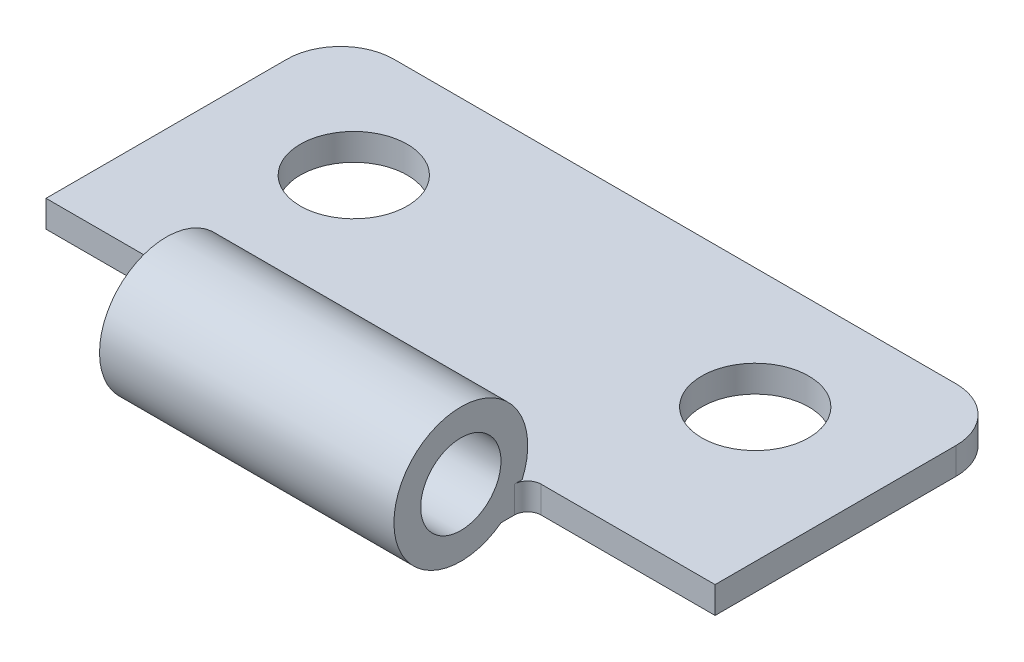
ISO-10303-21;
HEADER;
FILE_DESCRIPTION(('STEP AP214'),'2;1');
FILE_NAME('part.step','',(''),(''),'','','');
FILE_SCHEMA(('AUTOMOTIVE_DESIGN { 1 0 10303 214 1 1 1 1 }'));
ENDSEC;
DATA;
#1=APPLICATION_CONTEXT('core data for automotive mechanical design processes');
#2=APPLICATION_PROTOCOL_DEFINITION('international standard','automotive_design',2000,#1);
#3=PRODUCT_CONTEXT('',#1,'mechanical');
#4=PRODUCT('Part','Part','',(#3));
#5=PRODUCT_RELATED_PRODUCT_CATEGORY('part','',(#4));
#6=PRODUCT_DEFINITION_FORMATION('','',#4);
#7=PRODUCT_DEFINITION_CONTEXT('part definition',#1,'design');
#8=PRODUCT_DEFINITION('design','',#6,#7);
#9=PRODUCT_DEFINITION_SHAPE('','',#8);
#10=(LENGTH_UNIT() NAMED_UNIT(*) SI_UNIT(.MILLI.,.METRE.));
#11=(NAMED_UNIT(*) PLANE_ANGLE_UNIT() SI_UNIT($,.RADIAN.));
#12=(NAMED_UNIT(*) SI_UNIT($,.STERADIAN.) SOLID_ANGLE_UNIT());
#13=UNCERTAINTY_MEASURE_WITH_UNIT(LENGTH_MEASURE(1.E-05),#10,'distance_accuracy_value','');
#14=(GEOMETRIC_REPRESENTATION_CONTEXT(3) GLOBAL_UNCERTAINTY_ASSIGNED_CONTEXT((#13)) GLOBAL_UNIT_ASSIGNED_CONTEXT((#10,
#11,#12)) REPRESENTATION_CONTEXT('',''));
#15=CARTESIAN_POINT('',(0.,0.,0.));
#16=DIRECTION('',(0.,0.,1.));
#17=DIRECTION('',(1.,0.,0.));
#18=AXIS2_PLACEMENT_3D('',#15,#16,#17);
#19=CARTESIAN_POINT('',(0.,1.,0.));
#20=DIRECTION('',(0.,-1.,0.));
#21=DIRECTION('',(0.,0.,-1.));
#22=AXIS2_PLACEMENT_3D('',#19,#20,#21);
#23=PLANE('',#22);
#24=DIRECTION('',(-1.,0.,0.));
#25=VECTOR('',#24,1.);
#26=CARTESIAN_POINT('',(5.5,1.,-0.791287847477918));
#27=LINE('',#26,#25);
#28=CARTESIAN_POINT('',(5.5,1.,-0.791287847477918));
#29=VERTEX_POINT('',#28);
#30=CARTESIAN_POINT('',(-5.5,1.,-0.791287847477918));
#31=VERTEX_POINT('',#30);
#32=EDGE_CURVE('E56',#29,#31,#27,.T.);
#33=ORIENTED_EDGE('',*,*,#32,.F.);
#34=DIRECTION('',(0.,0.,1.));
#35=VECTOR('',#34,1.);
#36=CARTESIAN_POINT('',(5.5,1.,0.));
#37=LINE('',#36,#35);
#38=CARTESIAN_POINT('',(5.5,1.,-0.499999999999997));
#39=VERTEX_POINT('',#38);
#40=EDGE_CURVE('E153',#29,#39,#37,.T.);
#41=ORIENTED_EDGE('',*,*,#40,.T.);
#42=CARTESIAN_POINT('',(6.,1.,-0.499999999999997));
#43=DIRECTION('',(0.,-1.,0.));
#44=DIRECTION('',(0.,0.,-1.));
#45=AXIS2_PLACEMENT_3D('',#42,#43,#44);
#46=CIRCLE('',#45,0.5);
#47=CARTESIAN_POINT('',(6.,1.,-0.999999999999997));
#48=VERTEX_POINT('',#47);
#49=EDGE_CURVE('E236',#39,#48,#46,.T.);
#50=ORIENTED_EDGE('',*,*,#49,.T.);
#51=DIRECTION('',(1.,0.,0.));
#52=VECTOR('',#51,1.);
#53=CARTESIAN_POINT('',(5.5,1.,-0.999999999999997));
#54=LINE('',#53,#52);
#55=CARTESIAN_POINT('',(12.5,1.,-0.999999999999996));
#56=VERTEX_POINT('',#55);
#57=EDGE_CURVE('E182',#48,#56,#54,.T.);
#58=ORIENTED_EDGE('',*,*,#57,.T.);
#59=DIRECTION('',(0.,0.,-1.));
#60=VECTOR('',#59,1.);
#61=CARTESIAN_POINT('',(12.5,1.,-12.));
#62=LINE('',#61,#60);
#63=CARTESIAN_POINT('',(12.5,1.,-10.));
#64=VERTEX_POINT('',#63);
#65=EDGE_CURVE('E184',#56,#64,#62,.T.);
#66=ORIENTED_EDGE('',*,*,#65,.T.);
#67=CARTESIAN_POINT('',(10.5,1.,-10.));
#68=DIRECTION('',(0.,-1.,0.));
#69=DIRECTION('',(0.,0.,-1.));
#70=AXIS2_PLACEMENT_3D('',#67,#68,#69);
#71=CIRCLE('',#70,2.);
#72=CARTESIAN_POINT('',(10.5,1.,-12.));
#73=VERTEX_POINT('',#72);
#74=EDGE_CURVE('E219',#64,#73,#71,.F.);
#75=ORIENTED_EDGE('',*,*,#74,.T.);
#76=DIRECTION('',(-1.,0.,0.));
#77=VECTOR('',#76,1.);
#78=CARTESIAN_POINT('',(-12.5,1.,-12.));
#79=LINE('',#78,#77);
#80=CARTESIAN_POINT('',(-10.5,1.,-12.));
#81=VERTEX_POINT('',#80);
#82=EDGE_CURVE('E189',#73,#81,#79,.T.);
#83=ORIENTED_EDGE('',*,*,#82,.T.);
#84=CARTESIAN_POINT('',(-10.5,1.,-10.));
#85=DIRECTION('',(0.,-1.,0.));
#86=DIRECTION('',(0.,0.,-1.));
#87=AXIS2_PLACEMENT_3D('',#84,#85,#86);
#88=CIRCLE('',#87,2.);
#89=CARTESIAN_POINT('',(-12.5,1.,-10.));
#90=VERTEX_POINT('',#89);
#91=EDGE_CURVE('E225',#81,#90,#88,.F.);
#92=ORIENTED_EDGE('',*,*,#91,.T.);
#93=DIRECTION('',(0.,0.,1.));
#94=VECTOR('',#93,1.);
#95=CARTESIAN_POINT('',(-12.5,1.,-0.999999999999996));
#96=LINE('',#95,#94);
#97=CARTESIAN_POINT('',(-12.5,1.,-0.999999999999996));
#98=VERTEX_POINT('',#97);
#99=EDGE_CURVE('E180',#90,#98,#96,.T.);
#100=ORIENTED_EDGE('',*,*,#99,.T.);
#101=DIRECTION('',(1.,0.,0.));
#102=VECTOR('',#101,1.);
#103=CARTESIAN_POINT('',(-12.5,1.,-0.999999999999996));
#104=LINE('',#103,#102);
#105=CARTESIAN_POINT('',(-6.,1.,-0.999999999999997));
#106=VERTEX_POINT('',#105);
#107=EDGE_CURVE('E177',#98,#106,#104,.T.);
#108=ORIENTED_EDGE('',*,*,#107,.T.);
#109=CARTESIAN_POINT('',(-6.,1.,-0.499999999999997));
#110=DIRECTION('',(0.,-1.,0.));
#111=DIRECTION('',(0.,0.,-1.));
#112=AXIS2_PLACEMENT_3D('',#109,#110,#111);
#113=CIRCLE('',#112,0.5);
#114=CARTESIAN_POINT('',(-5.5,1.,-0.499999999999997));
#115=VERTEX_POINT('',#114);
#116=EDGE_CURVE('E11',#106,#115,#113,.T.);
#117=ORIENTED_EDGE('',*,*,#116,.T.);
#118=DIRECTION('',(0.,0.,1.));
#119=VECTOR('',#118,1.);
#120=CARTESIAN_POINT('',(-5.5,1.,0.));
#121=LINE('',#120,#119);
#122=EDGE_CURVE('E54',#31,#115,#121,.T.);
#123=ORIENTED_EDGE('',*,*,#122,.F.);
#124=EDGE_LOOP('',(#33,#41,#50,#58,#66,#75,#83,#92,#100,#108,#117,#123));
#125=FACE_BOUND('',#124,.T.);
#126=CARTESIAN_POINT('',(7.5,1.,-7.5));
#127=DIRECTION('',(0.,1.,0.));
#128=DIRECTION('',(0.,0.,1.));
#129=AXIS2_PLACEMENT_3D('',#126,#127,#128);
#130=CIRCLE('',#129,2.);
#131=CARTESIAN_POINT('',(7.5,1.,-5.5));
#132=VERTEX_POINT('',#131);
#133=EDGE_CURVE('E171',#132,#132,#130,.T.);
#134=ORIENTED_EDGE('',*,*,#133,.F.);
#135=EDGE_LOOP('',(#134));
#136=FACE_BOUND('',#135,.T.);
#137=CARTESIAN_POINT('',(-7.5,1.,-7.5));
#138=DIRECTION('',(0.,1.,0.));
#139=DIRECTION('',(0.,0.,1.));
#140=AXIS2_PLACEMENT_3D('',#137,#138,#139);
#141=CIRCLE('',#140,2.);
#142=CARTESIAN_POINT('',(-7.5,1.,-5.5));
#143=VERTEX_POINT('',#142);
#144=EDGE_CURVE('E164',#143,#143,#141,.T.);
#145=ORIENTED_EDGE('',*,*,#144,.F.);
#146=EDGE_LOOP('',(#145));
#147=FACE_BOUND('',#146,.T.);
#148=ADVANCED_FACE('F41',(#125,#136,#147),#23,.F.);
#149=CARTESIAN_POINT('',(0.,0.,0.));
#150=DIRECTION('',(0.,-1.,0.));
#151=DIRECTION('',(0.,0.,-1.));
#152=AXIS2_PLACEMENT_3D('',#149,#150,#151);
#153=PLANE('',#152);
#154=CARTESIAN_POINT('',(7.5,0.,-7.5));
#155=DIRECTION('',(0.,1.,0.));
#156=DIRECTION('',(0.,0.,1.));
#157=AXIS2_PLACEMENT_3D('',#154,#155,#156);
#158=CIRCLE('',#157,2.);
#159=CARTESIAN_POINT('',(7.5,0.,-5.5));
#160=VERTEX_POINT('',#159);
#161=EDGE_CURVE('E166',#160,#160,#158,.T.);
#162=ORIENTED_EDGE('',*,*,#161,.T.);
#163=EDGE_LOOP('',(#162));
#164=FACE_BOUND('',#163,.T.);
#165=DIRECTION('',(0.,0.,1.));
#166=VECTOR('',#165,1.);
#167=CARTESIAN_POINT('',(-12.5,0.,-0.999999999999996));
#168=LINE('',#167,#166);
#169=CARTESIAN_POINT('',(-12.5,0.,-10.));
#170=VERTEX_POINT('',#169);
#171=CARTESIAN_POINT('',(-12.5,0.,-0.999999999999996));
#172=VERTEX_POINT('',#171);
#173=EDGE_CURVE('E172',#170,#172,#168,.T.);
#174=ORIENTED_EDGE('',*,*,#173,.F.);
#175=CARTESIAN_POINT('',(-10.5,0.,-10.));
#176=DIRECTION('',(0.,-1.,0.));
#177=DIRECTION('',(0.,0.,-1.));
#178=AXIS2_PLACEMENT_3D('',#175,#176,#177);
#179=CIRCLE('',#178,2.);
#180=CARTESIAN_POINT('',(-10.5,0.,-12.));
#181=VERTEX_POINT('',#180);
#182=EDGE_CURVE('E214',#170,#181,#179,.T.);
#183=ORIENTED_EDGE('',*,*,#182,.T.);
#184=DIRECTION('',(-1.,0.,0.));
#185=VECTOR('',#184,1.);
#186=CARTESIAN_POINT('',(-12.5,0.,-12.));
#187=LINE('',#186,#185);
#188=CARTESIAN_POINT('',(10.5,0.,-12.));
#189=VERTEX_POINT('',#188);
#190=EDGE_CURVE('E179',#189,#181,#187,.T.);
#191=ORIENTED_EDGE('',*,*,#190,.F.);
#192=CARTESIAN_POINT('',(10.5,0.,-10.));
#193=DIRECTION('',(0.,-1.,0.));
#194=DIRECTION('',(0.,0.,-1.));
#195=AXIS2_PLACEMENT_3D('',#192,#193,#194);
#196=CIRCLE('',#195,2.);
#197=CARTESIAN_POINT('',(12.5,0.,-10.));
#198=VERTEX_POINT('',#197);
#199=EDGE_CURVE('E212',#189,#198,#196,.T.);
#200=ORIENTED_EDGE('',*,*,#199,.T.);
#201=DIRECTION('',(0.,0.,-1.));
#202=VECTOR('',#201,1.);
#203=CARTESIAN_POINT('',(12.5,0.,-12.));
#204=LINE('',#203,#202);
#205=CARTESIAN_POINT('',(12.5,0.,-0.999999999999996));
#206=VERTEX_POINT('',#205);
#207=EDGE_CURVE('E198',#206,#198,#204,.T.);
#208=ORIENTED_EDGE('',*,*,#207,.F.);
#209=DIRECTION('',(1.,0.,0.));
#210=VECTOR('',#209,1.);
#211=CARTESIAN_POINT('',(5.5,0.,-0.999999999999997));
#212=LINE('',#211,#210);
#213=CARTESIAN_POINT('',(6.,0.,-0.999999999999997));
#214=VERTEX_POINT('',#213);
#215=EDGE_CURVE('E142',#214,#206,#212,.T.);
#216=ORIENTED_EDGE('',*,*,#215,.F.);
#217=CARTESIAN_POINT('',(6.,0.,-0.499999999999997));
#218=DIRECTION('',(0.,-1.,0.));
#219=DIRECTION('',(0.,0.,-1.));
#220=AXIS2_PLACEMENT_3D('',#217,#218,#219);
#221=CIRCLE('',#220,0.5);
#222=CARTESIAN_POINT('',(5.5,0.,-0.499999999999997));
#223=VERTEX_POINT('',#222);
#224=EDGE_CURVE('E140',#214,#223,#221,.F.);
#225=ORIENTED_EDGE('',*,*,#224,.T.);
#226=DIRECTION('',(0.,0.,-1.));
#227=VECTOR('',#226,1.);
#228=CARTESIAN_POINT('',(5.5,0.,0.));
#229=LINE('',#228,#227);
#230=CARTESIAN_POINT('',(5.5,0.,0.));
#231=VERTEX_POINT('',#230);
#232=EDGE_CURVE('E129',#231,#223,#229,.T.);
#233=ORIENTED_EDGE('',*,*,#232,.F.);
#234=DIRECTION('',(1.,0.,0.));
#235=VECTOR('',#234,1.);
#236=CARTESIAN_POINT('',(-5.5,0.,0.));
#237=LINE('',#236,#235);
#238=CARTESIAN_POINT('',(-5.5,0.,0.));
#239=VERTEX_POINT('',#238);
#240=EDGE_CURVE('E132',#239,#231,#237,.T.);
#241=ORIENTED_EDGE('',*,*,#240,.F.);
#242=DIRECTION('',(0.,0.,1.));
#243=VECTOR('',#242,1.);
#244=CARTESIAN_POINT('',(-5.5,0.,0.));
#245=LINE('',#244,#243);
#246=CARTESIAN_POINT('',(-5.5,0.,-0.499999999999997));
#247=VERTEX_POINT('',#246);
#248=EDGE_CURVE('E146',#247,#239,#245,.T.);
#249=ORIENTED_EDGE('',*,*,#248,.F.);
#250=CARTESIAN_POINT('',(-6.,0.,-0.499999999999997));
#251=DIRECTION('',(0.,-1.,0.));
#252=DIRECTION('',(0.,0.,-1.));
#253=AXIS2_PLACEMENT_3D('',#250,#251,#252);
#254=CIRCLE('',#253,0.5);
#255=CARTESIAN_POINT('',(-6.,0.,-0.999999999999997));
#256=VERTEX_POINT('',#255);
#257=EDGE_CURVE('E47',#247,#256,#254,.F.);
#258=ORIENTED_EDGE('',*,*,#257,.T.);
#259=DIRECTION('',(1.,0.,0.));
#260=VECTOR('',#259,1.);
#261=CARTESIAN_POINT('',(-12.5,0.,-0.999999999999996));
#262=LINE('',#261,#260);
#263=EDGE_CURVE('E194',#172,#256,#262,.T.);
#264=ORIENTED_EDGE('',*,*,#263,.F.);
#265=EDGE_LOOP('',(#174,#183,#191,#200,#208,#216,#225,#233,#241,#249,#258,#264));
#266=FACE_BOUND('',#265,.T.);
#267=CARTESIAN_POINT('',(-7.5,0.,-7.5));
#268=DIRECTION('',(0.,1.,0.));
#269=DIRECTION('',(0.,0.,1.));
#270=AXIS2_PLACEMENT_3D('',#267,#268,#269);
#271=CIRCLE('',#270,2.);
#272=CARTESIAN_POINT('',(-7.5,0.,-5.5));
#273=VERTEX_POINT('',#272);
#274=EDGE_CURVE('E165',#273,#273,#271,.T.);
#275=ORIENTED_EDGE('',*,*,#274,.T.);
#276=EDGE_LOOP('',(#275));
#277=FACE_BOUND('',#276,.T.);
#278=ADVANCED_FACE('F131',(#164,#266,#277),#153,.T.);
#279=CARTESIAN_POINT('',(-12.5,1.,-0.999999999999996));
#280=DIRECTION('',(1.,0.,0.));
#281=DIRECTION('',(0.,0.,-1.));
#282=AXIS2_PLACEMENT_3D('',#279,#280,#281);
#283=PLANE('',#282);
#284=ORIENTED_EDGE('',*,*,#99,.F.);
#285=DIRECTION('',(0.,-1.,0.));
#286=VECTOR('',#285,1.);
#287=CARTESIAN_POINT('',(-12.5,1.,-10.));
#288=LINE('',#287,#286);
#289=EDGE_CURVE('E206',#90,#170,#288,.T.);
#290=ORIENTED_EDGE('',*,*,#289,.T.);
#291=ORIENTED_EDGE('',*,*,#173,.T.);
#292=DIRECTION('',(0.,-1.,0.));
#293=VECTOR('',#292,1.);
#294=CARTESIAN_POINT('',(-12.5,1.,-0.999999999999996));
#295=LINE('',#294,#293);
#296=EDGE_CURVE('E204',#98,#172,#295,.T.);
#297=ORIENTED_EDGE('',*,*,#296,.F.);
#298=EDGE_LOOP('',(#284,#290,#291,#297));
#299=FACE_BOUND('',#298,.T.);
#300=ADVANCED_FACE('F249',(#299),#283,.F.);
#301=CARTESIAN_POINT('',(-12.5,1.,-0.999999999999996));
#302=DIRECTION('',(0.,0.,-1.));
#303=DIRECTION('',(-1.,0.,0.));
#304=AXIS2_PLACEMENT_3D('',#301,#302,#303);
#305=PLANE('',#304);
#306=ORIENTED_EDGE('',*,*,#263,.T.);
#307=DIRECTION('',(0.,-1.,0.));
#308=VECTOR('',#307,1.);
#309=CARTESIAN_POINT('',(-6.,1.,-0.999999999999997));
#310=LINE('',#309,#308);
#311=EDGE_CURVE('E231',#256,#106,#310,.F.);
#312=ORIENTED_EDGE('',*,*,#311,.T.);
#313=ORIENTED_EDGE('',*,*,#107,.F.);
#314=ORIENTED_EDGE('',*,*,#296,.T.);
#315=EDGE_LOOP('',(#306,#312,#313,#314));
#316=FACE_BOUND('',#315,.T.);
#317=ADVANCED_FACE('F243',(#316),#305,.F.);
#318=CARTESIAN_POINT('',(-5.5,1.,0.));
#319=DIRECTION('',(1.,0.,0.));
#320=DIRECTION('',(0.,0.,-1.));
#321=AXIS2_PLACEMENT_3D('',#318,#319,#320);
#322=PLANE('',#321);
#323=ORIENTED_EDGE('',*,*,#248,.T.);
#324=CARTESIAN_POINT('',(-5.5,2.,1.5));
#325=DIRECTION('',(1.,0.,0.));
#326=DIRECTION('',(0.,0.,-1.));
#327=AXIS2_PLACEMENT_3D('',#324,#325,#326);
#328=CIRCLE('',#327,2.5);
#329=EDGE_CURVE('E149',#31,#239,#328,.T.);
#330=ORIENTED_EDGE('',*,*,#329,.F.);
#331=ORIENTED_EDGE('',*,*,#122,.T.);
#332=DIRECTION('',(0.,-1.,0.));
#333=VECTOR('',#332,1.);
#334=CARTESIAN_POINT('',(-5.5,0.,-0.499999999999997));
#335=LINE('',#334,#333);
#336=EDGE_CURVE('E233',#115,#247,#335,.T.);
#337=ORIENTED_EDGE('',*,*,#336,.T.);
#338=EDGE_LOOP('',(#323,#330,#331,#337));
#339=FACE_BOUND('',#338,.T.);
#340=CARTESIAN_POINT('',(-5.5,2.,1.5));
#341=DIRECTION('',(1.,0.,0.));
#342=DIRECTION('',(0.,0.,-1.));
#343=AXIS2_PLACEMENT_3D('',#340,#341,#342);
#344=CIRCLE('',#343,1.5);
#345=CARTESIAN_POINT('',(-5.5,2.,0.));
#346=VERTEX_POINT('',#345);
#347=EDGE_CURVE('E158',#346,#346,#344,.T.);
#348=ORIENTED_EDGE('',*,*,#347,.T.);
#349=EDGE_LOOP('',(#348));
#350=FACE_BOUND('',#349,.T.);
#351=ADVANCED_FACE('F305',(#339,#350),#322,.F.);
#352=CARTESIAN_POINT('',(5.5,1.,0.));
#353=DIRECTION('',(-1.,0.,0.));
#354=DIRECTION('',(0.,0.,1.));
#355=AXIS2_PLACEMENT_3D('',#352,#353,#354);
#356=PLANE('',#355);
#357=DIRECTION('',(0.,-1.,0.));
#358=VECTOR('',#357,1.);
#359=CARTESIAN_POINT('',(5.5,1.,-0.499999999999997));
#360=LINE('',#359,#358);
#361=EDGE_CURVE('E230',#223,#39,#360,.F.);
#362=ORIENTED_EDGE('',*,*,#361,.T.);
#363=ORIENTED_EDGE('',*,*,#40,.F.);
#364=CARTESIAN_POINT('',(5.5,2.,1.5));
#365=DIRECTION('',(1.,0.,0.));
#366=DIRECTION('',(0.,0.,-1.));
#367=AXIS2_PLACEMENT_3D('',#364,#365,#366);
#368=CIRCLE('',#367,2.5);
#369=EDGE_CURVE('E147',#29,#231,#368,.T.);
#370=ORIENTED_EDGE('',*,*,#369,.T.);
#371=ORIENTED_EDGE('',*,*,#232,.T.);
#372=EDGE_LOOP('',(#362,#363,#370,#371));
#373=FACE_BOUND('',#372,.T.);
#374=CARTESIAN_POINT('',(5.5,2.,1.5));
#375=DIRECTION('',(1.,0.,0.));
#376=DIRECTION('',(0.,0.,-1.));
#377=AXIS2_PLACEMENT_3D('',#374,#375,#376);
#378=CIRCLE('',#377,1.5);
#379=CARTESIAN_POINT('',(5.5,2.,0.));
#380=VERTEX_POINT('',#379);
#381=EDGE_CURVE('E156',#380,#380,#378,.T.);
#382=ORIENTED_EDGE('',*,*,#381,.F.);
#383=EDGE_LOOP('',(#382));
#384=FACE_BOUND('',#383,.T.);
#385=ADVANCED_FACE('F151',(#373,#384),#356,.F.);
#386=CARTESIAN_POINT('',(5.5,1.,-0.999999999999997));
#387=DIRECTION('',(0.,0.,-1.));
#388=DIRECTION('',(-1.,0.,0.));
#389=AXIS2_PLACEMENT_3D('',#386,#387,#388);
#390=PLANE('',#389);
#391=ORIENTED_EDGE('',*,*,#57,.F.);
#392=DIRECTION('',(0.,-1.,0.));
#393=VECTOR('',#392,1.);
#394=CARTESIAN_POINT('',(6.,0.,-0.999999999999997));
#395=LINE('',#394,#393);
#396=EDGE_CURVE('E228',#48,#214,#395,.T.);
#397=ORIENTED_EDGE('',*,*,#396,.T.);
#398=ORIENTED_EDGE('',*,*,#215,.T.);
#399=DIRECTION('',(0.,-1.,0.));
#400=VECTOR('',#399,1.);
#401=CARTESIAN_POINT('',(12.5,1.,-0.999999999999996));
#402=LINE('',#401,#400);
#403=EDGE_CURVE('E192',#56,#206,#402,.T.);
#404=ORIENTED_EDGE('',*,*,#403,.F.);
#405=EDGE_LOOP('',(#391,#397,#398,#404));
#406=FACE_BOUND('',#405,.T.);
#407=ADVANCED_FACE('F275',(#406),#390,.F.);
#408=CARTESIAN_POINT('',(12.5,1.,-12.));
#409=DIRECTION('',(-1.,0.,0.));
#410=DIRECTION('',(0.,0.,1.));
#411=AXIS2_PLACEMENT_3D('',#408,#409,#410);
#412=PLANE('',#411);
#413=ORIENTED_EDGE('',*,*,#207,.T.);
#414=DIRECTION('',(0.,-1.,0.));
#415=VECTOR('',#414,1.);
#416=CARTESIAN_POINT('',(12.5,1.,-10.));
#417=LINE('',#416,#415);
#418=EDGE_CURVE('E223',#198,#64,#417,.F.);
#419=ORIENTED_EDGE('',*,*,#418,.T.);
#420=ORIENTED_EDGE('',*,*,#65,.F.);
#421=ORIENTED_EDGE('',*,*,#403,.T.);
#422=EDGE_LOOP('',(#413,#419,#420,#421));
#423=FACE_BOUND('',#422,.T.);
#424=ADVANCED_FACE('F270',(#423),#412,.F.);
#425=CARTESIAN_POINT('',(-12.5,1.,-12.));
#426=DIRECTION('',(0.,0.,1.));
#427=DIRECTION('',(1.,0.,0.));
#428=AXIS2_PLACEMENT_3D('',#425,#426,#427);
#429=PLANE('',#428);
#430=ORIENTED_EDGE('',*,*,#190,.T.);
#431=DIRECTION('',(0.,-1.,0.));
#432=VECTOR('',#431,1.);
#433=CARTESIAN_POINT('',(-10.5,1.,-12.));
#434=LINE('',#433,#432);
#435=EDGE_CURVE('E218',#181,#81,#434,.F.);
#436=ORIENTED_EDGE('',*,*,#435,.T.);
#437=ORIENTED_EDGE('',*,*,#82,.F.);
#438=DIRECTION('',(0.,-1.,0.));
#439=VECTOR('',#438,1.);
#440=CARTESIAN_POINT('',(10.5,1.,-12.));
#441=LINE('',#440,#439);
#442=EDGE_CURVE('E213',#73,#189,#441,.T.);
#443=ORIENTED_EDGE('',*,*,#442,.T.);
#444=EDGE_LOOP('',(#430,#436,#437,#443));
#445=FACE_BOUND('',#444,.T.);
#446=ADVANCED_FACE('F257',(#445),#429,.F.);
#447=CARTESIAN_POINT('',(7.5,1.,-7.5));
#448=DIRECTION('',(0.,-1.,0.));
#449=DIRECTION('',(0.,0.,-1.));
#450=AXIS2_PLACEMENT_3D('',#447,#448,#449);
#451=CYLINDRICAL_SURFACE('',#450,2.);
#452=ORIENTED_EDGE('',*,*,#133,.T.);
#453=EDGE_LOOP('',(#452));
#454=FACE_BOUND('',#453,.T.);
#455=ORIENTED_EDGE('',*,*,#161,.F.);
#456=EDGE_LOOP('',(#455));
#457=FACE_BOUND('',#456,.T.);
#458=ADVANCED_FACE('F291',(#454,#457),#451,.F.);
#459=CARTESIAN_POINT('',(-7.5,1.,-7.5));
#460=DIRECTION('',(0.,-1.,0.));
#461=DIRECTION('',(0.,0.,-1.));
#462=AXIS2_PLACEMENT_3D('',#459,#460,#461);
#463=CYLINDRICAL_SURFACE('',#462,2.);
#464=ORIENTED_EDGE('',*,*,#144,.T.);
#465=EDGE_LOOP('',(#464));
#466=FACE_BOUND('',#465,.T.);
#467=ORIENTED_EDGE('',*,*,#274,.F.);
#468=EDGE_LOOP('',(#467));
#469=FACE_BOUND('',#468,.T.);
#470=ADVANCED_FACE('F311',(#466,#469),#463,.F.);
#471=CARTESIAN_POINT('',(-10.5,1.,-10.));
#472=DIRECTION('',(0.,-1.,0.));
#473=DIRECTION('',(0.,0.,-1.));
#474=AXIS2_PLACEMENT_3D('',#471,#472,#473);
#475=CYLINDRICAL_SURFACE('',#474,2.);
#476=ORIENTED_EDGE('',*,*,#91,.F.);
#477=ORIENTED_EDGE('',*,*,#435,.F.);
#478=ORIENTED_EDGE('',*,*,#182,.F.);
#479=ORIENTED_EDGE('',*,*,#289,.F.);
#480=EDGE_LOOP('',(#476,#477,#478,#479));
#481=FACE_BOUND('',#480,.T.);
#482=ADVANCED_FACE('F258',(#481),#475,.T.);
#483=CARTESIAN_POINT('',(10.5,1.,-10.));
#484=DIRECTION('',(0.,-1.,0.));
#485=DIRECTION('',(0.,0.,-1.));
#486=AXIS2_PLACEMENT_3D('',#483,#484,#485);
#487=CYLINDRICAL_SURFACE('',#486,2.);
#488=ORIENTED_EDGE('',*,*,#74,.F.);
#489=ORIENTED_EDGE('',*,*,#418,.F.);
#490=ORIENTED_EDGE('',*,*,#199,.F.);
#491=ORIENTED_EDGE('',*,*,#442,.F.);
#492=EDGE_LOOP('',(#488,#489,#490,#491));
#493=FACE_BOUND('',#492,.T.);
#494=ADVANCED_FACE('F263',(#493),#487,.T.);
#495=CARTESIAN_POINT('',(6.,1.,-0.499999999999997));
#496=DIRECTION('',(0.,1.,0.));
#497=DIRECTION('',(0.,0.,1.));
#498=AXIS2_PLACEMENT_3D('',#495,#496,#497);
#499=CYLINDRICAL_SURFACE('',#498,0.5);
#500=ORIENTED_EDGE('',*,*,#49,.F.);
#501=ORIENTED_EDGE('',*,*,#361,.F.);
#502=ORIENTED_EDGE('',*,*,#224,.F.);
#503=ORIENTED_EDGE('',*,*,#396,.F.);
#504=EDGE_LOOP('',(#500,#501,#502,#503));
#505=FACE_BOUND('',#504,.T.);
#506=ADVANCED_FACE('F277',(#505),#499,.F.);
#507=CARTESIAN_POINT('',(-6.,1.,-0.499999999999997));
#508=DIRECTION('',(0.,1.,0.));
#509=DIRECTION('',(0.,0.,1.));
#510=AXIS2_PLACEMENT_3D('',#507,#508,#509);
#511=CYLINDRICAL_SURFACE('',#510,0.5);
#512=ORIENTED_EDGE('',*,*,#116,.F.);
#513=ORIENTED_EDGE('',*,*,#311,.F.);
#514=ORIENTED_EDGE('',*,*,#257,.F.);
#515=ORIENTED_EDGE('',*,*,#336,.F.);
#516=EDGE_LOOP('',(#512,#513,#514,#515));
#517=FACE_BOUND('',#516,.T.);
#518=ADVANCED_FACE('F43',(#517),#511,.F.);
#519=CARTESIAN_POINT('',(5.5,2.,1.5));
#520=DIRECTION('',(-1.,0.,0.));
#521=DIRECTION('',(0.,0.,1.));
#522=AXIS2_PLACEMENT_3D('',#519,#520,#521);
#523=CYLINDRICAL_SURFACE('',#522,2.5);
#524=ORIENTED_EDGE('',*,*,#369,.F.);
#525=ORIENTED_EDGE('',*,*,#32,.T.);
#526=ORIENTED_EDGE('',*,*,#329,.T.);
#527=ORIENTED_EDGE('',*,*,#240,.T.);
#528=EDGE_LOOP('',(#524,#525,#526,#527));
#529=FACE_BOUND('',#528,.T.);
#530=ADVANCED_FACE('F143',(#529),#523,.T.);
#531=CARTESIAN_POINT('',(5.5,2.,1.5));
#532=DIRECTION('',(-1.,0.,0.));
#533=DIRECTION('',(0.,0.,1.));
#534=AXIS2_PLACEMENT_3D('',#531,#532,#533);
#535=CYLINDRICAL_SURFACE('',#534,1.5);
#536=ORIENTED_EDGE('',*,*,#381,.T.);
#537=EDGE_LOOP('',(#536));
#538=FACE_BOUND('',#537,.T.);
#539=ORIENTED_EDGE('',*,*,#347,.F.);
#540=EDGE_LOOP('',(#539));
#541=FACE_BOUND('',#540,.T.);
#542=ADVANCED_FACE('F321',(#538,#541),#535,.F.);
#543=CLOSED_SHELL('',(#148,#278,#300,#317,#351,#385,#407,#424,#446,#458,#470,#482,#494,#506,
#518,#530,#542));
#544=MANIFOLD_SOLID_BREP('B2',#543);
#545=ADVANCED_BREP_SHAPE_REPRESENTATION('',(#18,#544),#14);
#546=SHAPE_DEFINITION_REPRESENTATION(#9,#545);
ENDSEC;
END-ISO-10303-21;
